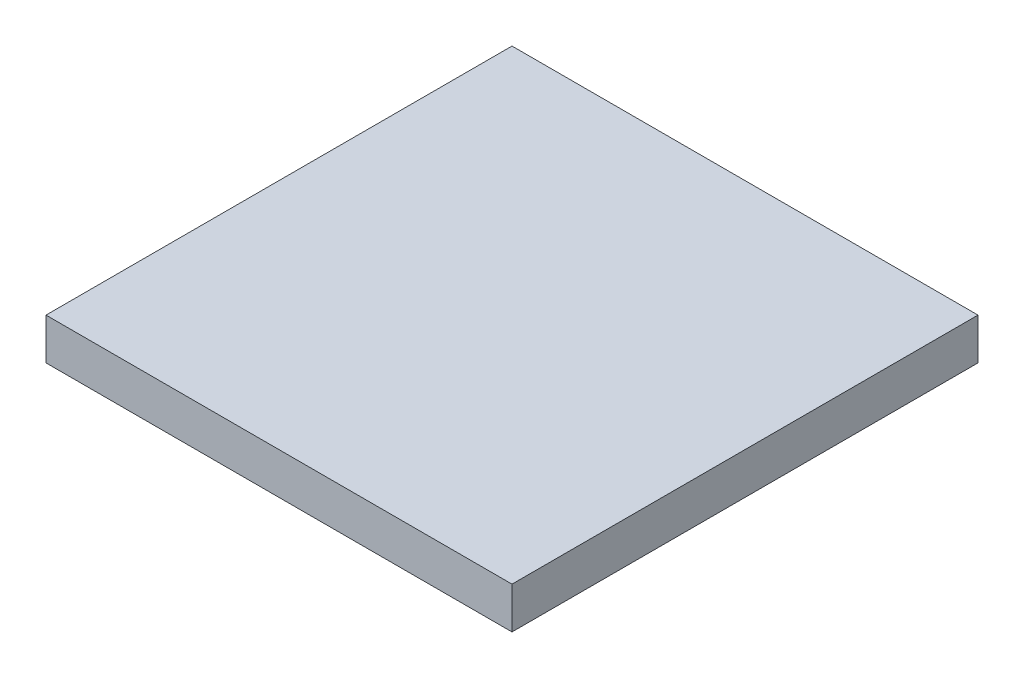
ISO-10303-21;
HEADER;
FILE_DESCRIPTION(('STEP AP214'),'2;1');
FILE_NAME('part.step','',(''),(''),'','','');
FILE_SCHEMA(('AUTOMOTIVE_DESIGN { 1 0 10303 214 1 1 1 1 }'));
ENDSEC;
DATA;
#1=APPLICATION_CONTEXT('core data for automotive mechanical design processes');
#2=APPLICATION_PROTOCOL_DEFINITION('international standard','automotive_design',2000,#1);
#3=PRODUCT_CONTEXT('',#1,'mechanical');
#4=PRODUCT('Part','Part','',(#3));
#5=PRODUCT_RELATED_PRODUCT_CATEGORY('part','',(#4));
#6=PRODUCT_DEFINITION_FORMATION('','',#4);
#7=PRODUCT_DEFINITION_CONTEXT('part definition',#1,'design');
#8=PRODUCT_DEFINITION('design','',#6,#7);
#9=PRODUCT_DEFINITION_SHAPE('','',#8);
#10=(LENGTH_UNIT() NAMED_UNIT(*) SI_UNIT(.MILLI.,.METRE.));
#11=(NAMED_UNIT(*) PLANE_ANGLE_UNIT() SI_UNIT($,.RADIAN.));
#12=(NAMED_UNIT(*) SI_UNIT($,.STERADIAN.) SOLID_ANGLE_UNIT());
#13=UNCERTAINTY_MEASURE_WITH_UNIT(LENGTH_MEASURE(1.E-05),#10,'distance_accuracy_value','');
#14=(GEOMETRIC_REPRESENTATION_CONTEXT(3) GLOBAL_UNCERTAINTY_ASSIGNED_CONTEXT((#13)) GLOBAL_UNIT_ASSIGNED_CONTEXT((#10,
#11,#12)) REPRESENTATION_CONTEXT('',''));
#15=CARTESIAN_POINT('',(0.,0.,0.));
#16=DIRECTION('',(0.,0.,1.));
#17=DIRECTION('',(1.,0.,0.));
#18=AXIS2_PLACEMENT_3D('',#15,#16,#17);
#19=CARTESIAN_POINT('',(0.,3.556,0.));
#20=DIRECTION('',(1.,0.,0.));
#21=DIRECTION('',(0.,0.,-1.));
#22=AXIS2_PLACEMENT_3D('',#19,#20,#21);
#23=PLANE('',#22);
#24=DIRECTION('',(0.,0.,1.));
#25=VECTOR('',#24,1.);
#26=CARTESIAN_POINT('',(0.,0.,0.));
#27=LINE('',#26,#25);
#28=CARTESIAN_POINT('',(0.,0.,-40.));
#29=VERTEX_POINT('',#28);
#30=CARTESIAN_POINT('',(0.,0.,0.));
#31=VERTEX_POINT('',#30);
#32=EDGE_CURVE('E107',#29,#31,#27,.T.);
#33=ORIENTED_EDGE('',*,*,#32,.T.);
#34=DIRECTION('',(0.,-1.,0.));
#35=VECTOR('',#34,1.);
#36=CARTESIAN_POINT('',(0.,3.556,0.));
#37=LINE('',#36,#35);
#38=CARTESIAN_POINT('',(0.,3.556,0.));
#39=VERTEX_POINT('',#38);
#40=EDGE_CURVE('E11',#39,#31,#37,.T.);
#41=ORIENTED_EDGE('',*,*,#40,.F.);
#42=DIRECTION('',(0.,0.,1.));
#43=VECTOR('',#42,1.);
#44=CARTESIAN_POINT('',(0.,3.556,0.));
#45=LINE('',#44,#43);
#46=CARTESIAN_POINT('',(0.,3.556,-40.));
#47=VERTEX_POINT('',#46);
#48=EDGE_CURVE('E91',#47,#39,#45,.T.);
#49=ORIENTED_EDGE('',*,*,#48,.F.);
#50=DIRECTION('',(0.,-1.,0.));
#51=VECTOR('',#50,1.);
#52=CARTESIAN_POINT('',(0.,3.556,-40.));
#53=LINE('',#52,#51);
#54=EDGE_CURVE('E103',#47,#29,#53,.T.);
#55=ORIENTED_EDGE('',*,*,#54,.T.);
#56=EDGE_LOOP('',(#33,#41,#49,#55));
#57=FACE_BOUND('',#56,.T.);
#58=ADVANCED_FACE('F39',(#57),#23,.F.);
#59=CARTESIAN_POINT('',(0.,3.556,0.));
#60=DIRECTION('',(0.,0.,-1.));
#61=DIRECTION('',(-1.,0.,0.));
#62=AXIS2_PLACEMENT_3D('',#59,#60,#61);
#63=PLANE('',#62);
#64=DIRECTION('',(1.,0.,0.));
#65=VECTOR('',#64,1.);
#66=CARTESIAN_POINT('',(0.,0.,0.));
#67=LINE('',#66,#65);
#68=CARTESIAN_POINT('',(40.,0.,0.));
#69=VERTEX_POINT('',#68);
#70=EDGE_CURVE('E96',#31,#69,#67,.T.);
#71=ORIENTED_EDGE('',*,*,#70,.T.);
#72=DIRECTION('',(0.,-1.,0.));
#73=VECTOR('',#72,1.);
#74=CARTESIAN_POINT('',(40.,3.556,0.));
#75=LINE('',#74,#73);
#76=CARTESIAN_POINT('',(40.,3.556,0.));
#77=VERTEX_POINT('',#76);
#78=EDGE_CURVE('E48',#77,#69,#75,.T.);
#79=ORIENTED_EDGE('',*,*,#78,.F.);
#80=DIRECTION('',(1.,0.,0.));
#81=VECTOR('',#80,1.);
#82=CARTESIAN_POINT('',(0.,3.556,0.));
#83=LINE('',#82,#81);
#84=EDGE_CURVE('E86',#39,#77,#83,.T.);
#85=ORIENTED_EDGE('',*,*,#84,.F.);
#86=ORIENTED_EDGE('',*,*,#40,.T.);
#87=EDGE_LOOP('',(#71,#79,#85,#86));
#88=FACE_BOUND('',#87,.T.);
#89=ADVANCED_FACE('F95',(#88),#63,.F.);
#90=CARTESIAN_POINT('',(40.,3.556,0.));
#91=DIRECTION('',(-1.,0.,0.));
#92=DIRECTION('',(0.,0.,1.));
#93=AXIS2_PLACEMENT_3D('',#90,#91,#92);
#94=PLANE('',#93);
#95=DIRECTION('',(0.,0.,-1.));
#96=VECTOR('',#95,1.);
#97=CARTESIAN_POINT('',(40.,0.,0.));
#98=LINE('',#97,#96);
#99=CARTESIAN_POINT('',(40.,0.,-40.));
#100=VERTEX_POINT('',#99);
#101=EDGE_CURVE('E73',#69,#100,#98,.T.);
#102=ORIENTED_EDGE('',*,*,#101,.T.);
#103=DIRECTION('',(0.,-1.,0.));
#104=VECTOR('',#103,1.);
#105=CARTESIAN_POINT('',(40.,3.556,-40.));
#106=LINE('',#105,#104);
#107=CARTESIAN_POINT('',(40.,3.556,-40.));
#108=VERTEX_POINT('',#107);
#109=EDGE_CURVE('E98',#108,#100,#106,.T.);
#110=ORIENTED_EDGE('',*,*,#109,.F.);
#111=DIRECTION('',(0.,0.,-1.));
#112=VECTOR('',#111,1.);
#113=CARTESIAN_POINT('',(40.,3.556,0.));
#114=LINE('',#113,#112);
#115=EDGE_CURVE('E89',#77,#108,#114,.T.);
#116=ORIENTED_EDGE('',*,*,#115,.F.);
#117=ORIENTED_EDGE('',*,*,#78,.T.);
#118=EDGE_LOOP('',(#102,#110,#116,#117));
#119=FACE_BOUND('',#118,.T.);
#120=ADVANCED_FACE('F99',(#119),#94,.F.);
#121=CARTESIAN_POINT('',(0.,3.556,-40.));
#122=DIRECTION('',(0.,0.,1.));
#123=DIRECTION('',(1.,0.,0.));
#124=AXIS2_PLACEMENT_3D('',#121,#122,#123);
#125=PLANE('',#124);
#126=DIRECTION('',(-1.,0.,0.));
#127=VECTOR('',#126,1.);
#128=CARTESIAN_POINT('',(0.,0.,-40.));
#129=LINE('',#128,#127);
#130=EDGE_CURVE('E79',#100,#29,#129,.T.);
#131=ORIENTED_EDGE('',*,*,#130,.T.);
#132=ORIENTED_EDGE('',*,*,#54,.F.);
#133=DIRECTION('',(-1.,0.,0.));
#134=VECTOR('',#133,1.);
#135=CARTESIAN_POINT('',(0.,3.556,-40.));
#136=LINE('',#135,#134);
#137=EDGE_CURVE('E56',#108,#47,#136,.T.);
#138=ORIENTED_EDGE('',*,*,#137,.F.);
#139=ORIENTED_EDGE('',*,*,#109,.T.);
#140=EDGE_LOOP('',(#131,#132,#138,#139));
#141=FACE_BOUND('',#140,.T.);
#142=ADVANCED_FACE('F120',(#141),#125,.F.);
#143=CARTESIAN_POINT('',(0.,3.556,0.));
#144=DIRECTION('',(0.,-1.,0.));
#145=DIRECTION('',(0.,0.,-1.));
#146=AXIS2_PLACEMENT_3D('',#143,#144,#145);
#147=PLANE('',#146);
#148=ORIENTED_EDGE('',*,*,#48,.T.);
#149=ORIENTED_EDGE('',*,*,#84,.T.);
#150=ORIENTED_EDGE('',*,*,#115,.T.);
#151=ORIENTED_EDGE('',*,*,#137,.T.);
#152=EDGE_LOOP('',(#148,#149,#150,#151));
#153=FACE_BOUND('',#152,.T.);
#154=ADVANCED_FACE('F87',(#153),#147,.F.);
#155=CARTESIAN_POINT('',(0.,0.,0.));
#156=DIRECTION('',(0.,-1.,0.));
#157=DIRECTION('',(0.,0.,-1.));
#158=AXIS2_PLACEMENT_3D('',#155,#156,#157);
#159=PLANE('',#158);
#160=ORIENTED_EDGE('',*,*,#32,.F.);
#161=ORIENTED_EDGE('',*,*,#130,.F.);
#162=ORIENTED_EDGE('',*,*,#101,.F.);
#163=ORIENTED_EDGE('',*,*,#70,.F.);
#164=EDGE_LOOP('',(#160,#161,#162,#163));
#165=FACE_BOUND('',#164,.T.);
#166=ADVANCED_FACE('F123',(#165),#159,.T.);
#167=CLOSED_SHELL('',(#58,#89,#120,#142,#154,#166));
#168=MANIFOLD_SOLID_BREP('B2',#167);
#169=ADVANCED_BREP_SHAPE_REPRESENTATION('',(#18,#168),#14);
#170=SHAPE_DEFINITION_REPRESENTATION(#9,#169);
ENDSEC;
END-ISO-10303-21;
